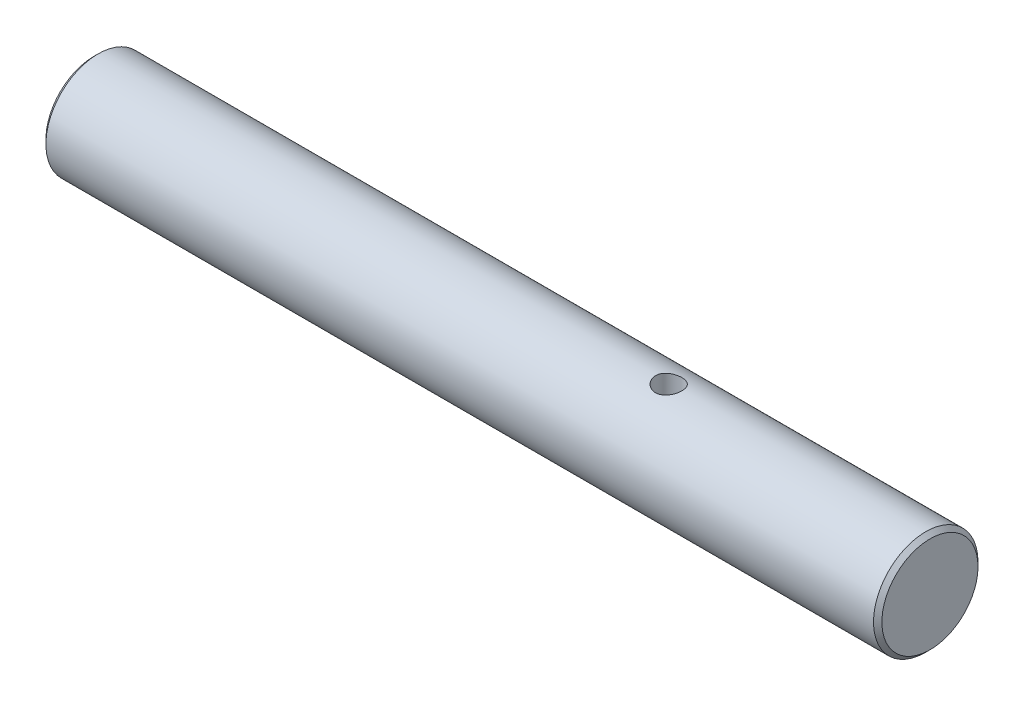
ISO-10303-21;
HEADER;
FILE_DESCRIPTION(('STEP AP214'),'2;1');
FILE_NAME('part.step','',(''),(''),'','','');
FILE_SCHEMA(('AUTOMOTIVE_DESIGN { 1 0 10303 214 1 1 1 1 }'));
ENDSEC;
DATA;
#1=APPLICATION_CONTEXT('core data for automotive mechanical design processes');
#2=APPLICATION_PROTOCOL_DEFINITION('international standard','automotive_design',2000,#1);
#3=PRODUCT_CONTEXT('',#1,'mechanical');
#4=PRODUCT('Part','Part','',(#3));
#5=PRODUCT_RELATED_PRODUCT_CATEGORY('part','',(#4));
#6=PRODUCT_DEFINITION_FORMATION('','',#4);
#7=PRODUCT_DEFINITION_CONTEXT('part definition',#1,'design');
#8=PRODUCT_DEFINITION('design','',#6,#7);
#9=PRODUCT_DEFINITION_SHAPE('','',#8);
#10=(LENGTH_UNIT() NAMED_UNIT(*) SI_UNIT(.MILLI.,.METRE.));
#11=(NAMED_UNIT(*) PLANE_ANGLE_UNIT() SI_UNIT($,.RADIAN.));
#12=(NAMED_UNIT(*) SI_UNIT($,.STERADIAN.) SOLID_ANGLE_UNIT());
#13=UNCERTAINTY_MEASURE_WITH_UNIT(LENGTH_MEASURE(1.E-05),#10,'distance_accuracy_value','');
#14=(GEOMETRIC_REPRESENTATION_CONTEXT(3) GLOBAL_UNCERTAINTY_ASSIGNED_CONTEXT((#13)) GLOBAL_UNIT_ASSIGNED_CONTEXT((#10,
#11,#12)) REPRESENTATION_CONTEXT('',''));
#15=CARTESIAN_POINT('',(0.,0.,0.));
#16=DIRECTION('',(0.,0.,1.));
#17=DIRECTION('',(1.,0.,0.));
#18=AXIS2_PLACEMENT_3D('',#15,#16,#17);
#19=CARTESIAN_POINT('',(-50.8,0.,0.));
#20=DIRECTION('',(1.,0.,0.));
#21=DIRECTION('',(0.,0.,-1.));
#22=AXIS2_PLACEMENT_3D('',#19,#20,#21);
#23=CYLINDRICAL_SURFACE('',#22,3.175);
#24=CARTESIAN_POINT('',(-15.0749,-3.175,0.));
#25=CARTESIAN_POINT('',(-15.0749012192326,-3.17499926061919,0.044194558615329));
#26=CARTESIAN_POINT('',(-15.0785740287583,-3.17406806749438,0.0884026685134962));
#27=CARTESIAN_POINT('',(-15.0931457555988,-3.17044360804568,0.175551121080481));
#28=CARTESIAN_POINT('',(-15.1040486960238,-3.16774936070479,0.218490744013717));
#29=CARTESIAN_POINT('',(-15.1327080596752,-3.16089702486516,0.301831200982996));
#30=CARTESIAN_POINT('',(-15.1504561813665,-3.15674071003248,0.34223504155801));
#31=CARTESIAN_POINT('',(-15.1922727137159,-3.14740649025808,0.419491994408565));
#32=CARTESIAN_POINT('',(-15.2163413623341,-3.14222854685513,0.456344972927149));
#33=CARTESIAN_POINT('',(-15.2706470530135,-3.13129183973811,0.526224337624056));
#34=CARTESIAN_POINT('',(-15.3009913725137,-3.12552400001613,0.559165938248033));
#35=CARTESIAN_POINT('',(-15.3667574018589,-3.11411763042046,0.619550450328698));
#36=CARTESIAN_POINT('',(-15.4021796932234,-3.10847911544268,0.64699273114974));
#37=CARTESIAN_POINT('',(-15.4777566379964,-3.09787815057358,0.69600008056985));
#38=CARTESIAN_POINT('',(-15.5179747585885,-3.09292721458745,0.717469990190073));
#39=CARTESIAN_POINT('',(-15.6015943665704,-3.08439445829358,0.75331107860638));
#40=CARTESIAN_POINT('',(-15.6449953347003,-3.08081241524987,0.767683412377865));
#41=CARTESIAN_POINT('',(-15.7328155539105,-3.07551634735535,0.788631519909633));
#42=CARTESIAN_POINT('',(-15.7771961526226,-3.07376581834439,0.795359890352631));
#43=CARTESIAN_POINT('',(-15.8664880592988,-3.07222173589316,0.801304443009542));
#44=CARTESIAN_POINT('',(-15.9113992782155,-3.0724278586232,0.800521868299323));
#45=CARTESIAN_POINT('',(-15.9993055352324,-3.07474099351563,0.791588424618985));
#46=CARTESIAN_POINT('',(-16.042320515769,-3.07680100843036,0.783619718053222));
#47=CARTESIAN_POINT('',(-16.1263824930664,-3.08251487674085,0.760830938475984));
#48=CARTESIAN_POINT('',(-16.1674293473854,-3.08616884530523,0.746010370389318));
#49=CARTESIAN_POINT('',(-16.2468767679294,-3.09470183518732,0.709784130628984));
#50=CARTESIAN_POINT('',(-16.2852459487121,-3.09959301241528,0.6883126114905));
#51=CARTESIAN_POINT('',(-16.3579018707644,-3.1100424831046,0.639440005835741));
#52=CARTESIAN_POINT('',(-16.3921878854377,-3.11560089494752,0.612037866407233));
#53=CARTESIAN_POINT('',(-16.4567477611494,-3.12695616041351,0.551139708525976));
#54=CARTESIAN_POINT('',(-16.4868764912911,-3.13275525500816,0.517490054895695));
#55=CARTESIAN_POINT('',(-16.5410911437239,-3.14379325801761,0.445546166570213));
#56=CARTESIAN_POINT('',(-16.5651768755484,-3.14903214877261,0.407251785536343));
#57=CARTESIAN_POINT('',(-16.6066763486564,-3.15838622444288,0.326896340185273));
#58=CARTESIAN_POINT('',(-16.6240662020502,-3.16249737135033,0.284822438451066));
#59=CARTESIAN_POINT('',(-16.6514856253308,-3.16910340089186,0.198221723445971));
#60=CARTESIAN_POINT('',(-16.6615166264302,-3.17159859779863,0.153695388957168));
#61=CARTESIAN_POINT('',(-16.6737112297412,-3.17464495997288,0.0646943274563268));
#62=CARTESIAN_POINT('',(-16.6760724329013,-3.17524494120777,0.0202483059449408));
#63=CARTESIAN_POINT('',(-16.6734028175583,-3.17457246064335,-0.0684039206917929));
#64=CARTESIAN_POINT('',(-16.6683726758745,-3.17330017028643,-0.112610147402936));
#65=CARTESIAN_POINT('',(-16.6512259453605,-3.16905741507741,-0.198839104279927));
#66=CARTESIAN_POINT('',(-16.639217438855,-3.16611286597304,-0.240884717578269));
#67=CARTESIAN_POINT('',(-16.6085785508337,-3.15885771002344,-0.322362309386602));
#68=CARTESIAN_POINT('',(-16.5899474944187,-3.15454696395491,-0.361794021029634));
#69=CARTESIAN_POINT('',(-16.5462113450995,-3.14492096545913,-0.437708527148821));
#70=CARTESIAN_POINT('',(-16.5209959478682,-3.13958905668079,-0.474125609611463));
#71=CARTESIAN_POINT('',(-16.4649476077615,-3.12853797087064,-0.54228157627721));
#72=CARTESIAN_POINT('',(-16.4341136789975,-3.12281872598345,-0.574019637677332));
#73=CARTESIAN_POINT('',(-16.3667854891433,-3.11146138201156,-0.632733099761772));
#74=CARTESIAN_POINT('',(-16.3301691147648,-3.10582887507164,-0.659569788448509));
#75=CARTESIAN_POINT('',(-16.2528363077356,-3.0954418007527,-0.7067178848178));
#76=CARTESIAN_POINT('',(-16.2121200564534,-3.09068719456386,-0.72702958098352));
#77=CARTESIAN_POINT('',(-16.1279603632697,-3.08264697495578,-0.760399482295295));
#78=CARTESIAN_POINT('',(-16.0845348216483,-3.07935268742908,-0.773500632643829));
#79=CARTESIAN_POINT('',(-15.9960015824923,-3.07459842402389,-0.792189542961761));
#80=CARTESIAN_POINT('',(-15.9508942622207,-3.07313803927642,-0.797778977689176));
#81=CARTESIAN_POINT('',(-15.8616904129164,-3.07224845084114,-0.801197231842083));
#82=CARTESIAN_POINT('',(-15.8176028289329,-3.07276118203122,-0.799247894762021));
#83=CARTESIAN_POINT('',(-15.7304067603455,-3.07562560581448,-0.788152468719857));
#84=CARTESIAN_POINT('',(-15.6872982554684,-3.07797726029449,-0.779006528913149));
#85=CARTESIAN_POINT('',(-15.6035296832745,-3.08422193358051,-0.75389957508709));
#86=CARTESIAN_POINT('',(-15.5628561934747,-3.08810538809145,-0.737980801869031));
#87=CARTESIAN_POINT('',(-15.4847280381596,-3.09697730115477,-0.699813386650078));
#88=CARTESIAN_POINT('',(-15.4472738271288,-3.10196591537456,-0.677563852803376));
#89=CARTESIAN_POINT('',(-15.3755769264148,-3.11265110668571,-0.626673714409328));
#90=CARTESIAN_POINT('',(-15.3414455414282,-3.11836293275759,-0.597879474387623));
#91=CARTESIAN_POINT('',(-15.2784269237736,-3.12976064187187,-0.535015840835662));
#92=CARTESIAN_POINT('',(-15.2495409413052,-3.13544651841542,-0.500945193291906));
#93=CARTESIAN_POINT('',(-15.1973119956564,-3.14627712643702,-0.427735831864607));
#94=CARTESIAN_POINT('',(-15.1740813546151,-3.15140991323625,-0.388515082759617));
#95=CARTESIAN_POINT('',(-15.1345801613398,-3.16042948515729,-0.306598877697786));
#96=CARTESIAN_POINT('',(-15.1183046818311,-3.16431715187398,-0.263905907189162));
#97=CARTESIAN_POINT('',(-15.0955577242808,-3.16984205709644,-0.184415357963877));
#98=CARTESIAN_POINT('',(-15.087827965283,-3.17176290620974,-0.147992420787638));
#99=CARTESIAN_POINT('',(-15.077498789471,-3.17434213973988,-0.0743828157800313));
#100=CARTESIAN_POINT('',(-15.0748989738368,-3.17500062229747,-0.0371962075462955));
#101=CARTESIAN_POINT('',(-15.0749,-3.175,0.));
#102=B_SPLINE_CURVE_WITH_KNOTS('',3,(#24,#25,#26,#27,#28,#29,#30,#31,#32,#33,#34,#35,#36,#37,
#38,#39,#40,#41,#42,#43,#44,#45,#46,#47,#48,#49,#50,#51,#52,#53,#54,#55,#56,#57,#58,#59,#60,#61,
#62,#63,#64,#65,#66,#67,#68,#69,#70,#71,#72,#73,#74,#75,#76,#77,#78,#79,#80,#81,#82,#83,#84,#85,
#86,#87,#88,#89,#90,#91,#92,#93,#94,#95,#96,#97,#98,#99,#100,#101),.UNSPECIFIED.,.T.,.F.,(4,2,2,
2,2,2,2,2,2,2,2,2,2,2,2,2,2,2,2,2,2,2,2,2,2,2,2,2,2,2,2,2,2,2,2,2,2,2,4),(0.,0.132447354071684,
0.264968468619232,0.397329370188534,0.52969525569568,0.664545055282163,0.799410309959517,
0.936315166227553,1.07319773687421,1.20729686173983,1.34137379332515,1.47214467066986,
1.60292499822566,1.73504389286222,1.86718626293194,2.00315952635134,2.139137074913,
2.27559533237844,2.41202704323488,2.5449146955339,2.67779018017591,2.80866052908661,
2.9395442187261,3.07277948800678,3.20603815875274,3.34262429115238,3.47920438397045,
3.61496196666796,3.75068927680842,3.88245336221338,4.01421471677338,4.145166078079,
4.27613589629705,4.41057382248032,4.54504374892683,4.68199913280024,4.81885733129726,
4.93033988654635,5.0418137744041),.UNSPECIFIED.);
#103=CARTESIAN_POINT('',(-15.0749,-3.175,0.));
#104=VERTEX_POINT('',#103);
#105=EDGE_CURVE('E10',#104,#104,#102,.T.);
#106=ORIENTED_EDGE('',*,*,#105,.F.);
#107=EDGE_LOOP('',(#106));
#108=FACE_BOUND('',#107,.T.);
#109=CARTESIAN_POINT('',(-15.875,3.07253396889278,0.8001));
#110=CARTESIAN_POINT('',(-15.8308305672585,3.0725348051082,0.80009876608396));
#111=CARTESIAN_POINT('',(-15.7866475523915,3.07349681294689,0.796429988216414));
#112=CARTESIAN_POINT('',(-15.6995511578479,3.07723087527521,0.781875724183331));
#113=CARTESIAN_POINT('',(-15.6566385197715,3.08000396604764,0.770986106273648));
#114=CARTESIAN_POINT('',(-15.5733552955042,3.08702663169601,0.742365674066662));
#115=CARTESIAN_POINT('',(-15.5329814732543,3.09127428006682,0.724643782790454));
#116=CARTESIAN_POINT('',(-15.4557753772485,3.10076505222951,0.682889132424946));
#117=CARTESIAN_POINT('',(-15.4189432687616,3.10600822244208,0.658856079029204));
#118=CARTESIAN_POINT('',(-15.3490427034007,3.11703050169978,0.604587336015973));
#119=CARTESIAN_POINT('',(-15.3160651058038,3.1228182852127,0.5742363543937));
#120=CARTESIAN_POINT('',(-15.2556104476428,3.1342024484424,0.508441593428325));
#121=CARTESIAN_POINT('',(-15.2281339076589,3.13979881000288,0.472997332638834));
#122=CARTESIAN_POINT('',(-15.1790887517436,3.15026563982044,0.397398807294971));
#123=CARTESIAN_POINT('',(-15.157609519229,3.15512467848743,0.357184835065325));
#124=CARTESIAN_POINT('',(-15.1217500781348,3.16347035165026,0.273574109685516));
#125=CARTESIAN_POINT('',(-15.1073688047817,3.16695719197537,0.230177835038971));
#126=CARTESIAN_POINT('',(-15.0864048936885,3.17210427187305,0.142381715626149));
#127=CARTESIAN_POINT('',(-15.0796679311182,3.17380060737892,0.0980208732345284));
#128=CARTESIAN_POINT('',(-15.0736993317476,3.17530138089332,0.00876837200928309));
#129=CARTESIAN_POINT('',(-15.0744665681941,3.17510610292711,-0.0361232061235494));
#130=CARTESIAN_POINT('',(-15.0833738651718,3.17287247229481,-0.124092092626158));
#131=CARTESIAN_POINT('',(-15.0913473286862,3.17087576768535,-0.167187486725854));
#132=CARTESIAN_POINT('',(-15.1141727991222,3.16531220584472,-0.251407740714446));
#133=CARTESIAN_POINT('',(-15.1290251754708,3.1617452642856,-0.292532494640615));
#134=CARTESIAN_POINT('',(-15.165320824012,3.15337852921137,-0.372081404316347));
#135=CARTESIAN_POINT('',(-15.1868231254213,3.14856776001674,-0.410477425105128));
#136=CARTESIAN_POINT('',(-15.2357634129958,3.13823480239744,-0.483174376361823));
#137=CARTESIAN_POINT('',(-15.2632024466213,3.13271248849945,-0.517474582516192));
#138=CARTESIAN_POINT('',(-15.324129371882,3.12137870903818,-0.581999914997204));
#139=CARTESIAN_POINT('',(-15.3577628117916,3.11556346791151,-0.612087095596401));
#140=CARTESIAN_POINT('',(-15.4296586440963,3.10443793195679,-0.666225302222772));
#141=CARTESIAN_POINT('',(-15.467921259912,3.09912766152255,-0.690276036737161));
#142=CARTESIAN_POINT('',(-15.5482632249244,3.08959960327955,-0.731748883874923));
#143=CARTESIAN_POINT('',(-15.5903606826335,3.08538740444006,-0.749137289300718));
#144=CARTESIAN_POINT('',(-15.6770132487871,3.07860382582511,-0.776546858345657));
#145=CARTESIAN_POINT('',(-15.7215678194291,3.0760320885288,-0.78656962729809));
#146=CARTESIAN_POINT('',(-15.810589316992,3.07289578590832,-0.798733500138195));
#147=CARTESIAN_POINT('',(-15.8550265470909,3.07227923911193,-0.801078776861646));
#148=CARTESIAN_POINT('',(-15.9436575894475,3.07298154579149,-0.79838047392185));
#149=CARTESIAN_POINT('',(-15.9878514241246,3.0743002179154,-0.793337586613739));
#150=CARTESIAN_POINT('',(-16.0739797054792,3.078674523571,-0.776185241982357));
#151=CARTESIAN_POINT('',(-16.1159395483724,3.08170080558703,-0.764195107307213));
#152=CARTESIAN_POINT('',(-16.1972536070939,3.08912138373645,-0.733621139693018));
#153=CARTESIAN_POINT('',(-16.2366075097886,3.09351584391164,-0.715036516050668));
#154=CARTESIAN_POINT('',(-16.3124563945191,3.10328675549971,-0.671375278486681));
#155=CARTESIAN_POINT('',(-16.3488789115875,3.10868100608242,-0.646176849375096));
#156=CARTESIAN_POINT('',(-16.4170535388242,3.11980024567038,-0.590156963316061));
#157=CARTESIAN_POINT('',(-16.4488048669868,3.12552528983102,-0.559334566788143));
#158=CARTESIAN_POINT('',(-16.5075652752706,3.1368375442012,-0.492003797605879));
#159=CARTESIAN_POINT('',(-16.5344329804822,3.14241753035757,-0.455370603384024));
#160=CARTESIAN_POINT('',(-16.5816355826269,3.15266017208134,-0.37799409525176));
#161=CARTESIAN_POINT('',(-16.6019708216732,3.15732287568298,-0.337250996728904));
#162=CARTESIAN_POINT('',(-16.6353533425045,3.16517608708767,-0.253093808281745));
#163=CARTESIAN_POINT('',(-16.648453333548,3.16837721210682,-0.20970166415928));
#164=CARTESIAN_POINT('',(-16.6671511626675,3.17299309716398,-0.121240327413036));
#165=CARTESIAN_POINT('',(-16.672750473423,3.17440820786392,-0.0761714657815543));
#166=CARTESIAN_POINT('',(-16.6762040473025,3.17527804356187,0.0130366929719295));
#167=CARTESIAN_POINT('',(-16.6742667970396,3.17478554122156,0.0571675254998983));
#168=CARTESIAN_POINT('',(-16.6631805391684,3.17201278591017,0.144453392991355));
#169=CARTESIAN_POINT('',(-16.6540317523715,3.16973258767686,0.187608457790416));
#170=CARTESIAN_POINT('',(-16.6288946759822,3.16364908220415,0.271495733854131));
#171=CARTESIAN_POINT('',(-16.6129446269524,3.15985429834767,0.31224006253659));
#172=CARTESIAN_POINT('',(-16.574692400912,3.15114088344559,0.390497311080539));
#173=CARTESIAN_POINT('',(-16.5523894119771,3.14622210876655,0.428009817106926));
#174=CARTESIAN_POINT('',(-16.5014315667621,3.13564137420049,0.499725063525822));
#175=CARTESIAN_POINT('',(-16.4726356294112,3.12996426893402,0.533825322892189));
#176=CARTESIAN_POINT('',(-16.4097824662886,3.1185740164936,0.596780398276611));
#177=CARTESIAN_POINT('',(-16.3757239031007,3.11286086051291,0.625633876836479));
#178=CARTESIAN_POINT('',(-16.30253186578,3.10192138340788,0.677816154241447));
#179=CARTESIAN_POINT('',(-16.2633141251648,3.09670640036459,0.701029325715569));
#180=CARTESIAN_POINT('',(-16.1814068362831,3.08750714520526,0.740498623876105));
#181=CARTESIAN_POINT('',(-16.1387198111394,3.08352198860927,0.756759753666212));
#182=CARTESIAN_POINT('',(-16.05926424991,3.0778483901463,0.779476362570762));
#183=CARTESIAN_POINT('',(-16.0228719317288,3.07587060885164,0.787193219392023));
#184=CARTESIAN_POINT('',(-15.949322902682,3.07321310375089,0.797505330997217));
#185=CARTESIAN_POINT('',(-15.9121662596438,3.07253326526138,0.800101038275592));
#186=CARTESIAN_POINT('',(-15.875,3.07253396889278,0.8001));
#187=B_SPLINE_CURVE_WITH_KNOTS('',3,(#109,#110,#111,#112,#113,#114,#115,#116,#117,#118,#119,
#120,#121,#122,#123,#124,#125,#126,#127,#128,#129,#130,#131,#132,#133,#134,#135,#136,#137,#138,
#139,#140,#141,#142,#143,#144,#145,#146,#147,#148,#149,#150,#151,#152,#153,#154,#155,#156,#157,
#158,#159,#160,#161,#162,#163,#164,#165,#166,#167,#168,#169,#170,#171,#172,#173,#174,#175,#176,
#177,#178,#179,#180,#181,#182,#183,#184,#185,#186),.UNSPECIFIED.,.T.,.F.,(4,2,2,2,2,2,2,2,2,2,2,
2,2,2,2,2,2,2,2,2,2,2,2,2,2,2,2,2,2,2,2,2,2,2,2,2,2,2,4),(0.,0.132371791473475,
0.264819391145222,0.397094595650513,0.529375969599578,0.664324502713228,0.799285800348928,
0.936162550045837,1.07301876044725,1.20705999107345,1.34108109575677,1.4720809347437,
1.6030878097993,1.73529269283765,1.86752092078446,2.00338412742358,2.13925389392323,
2.27580227382503,2.41232088430719,2.54517813851154,2.67802294327399,2.80865099299603,
2.93929471079365,3.07253788155873,3.20580333330295,3.342462890599,3.47911528970157,
3.61475857455171,3.75037522336786,3.882267296098,4.01415533056015,4.14531139561969,
4.27648423033722,4.41084208473558,4.5452341404627,4.68218456357767,4.81903626241781,
4.93043002105086,5.04181393671525),.UNSPECIFIED.);
#188=CARTESIAN_POINT('',(-15.875,3.07253396889278,0.8001));
#189=VERTEX_POINT('',#188);
#190=EDGE_CURVE('E57',#189,#189,#187,.T.);
#191=ORIENTED_EDGE('',*,*,#190,.F.);
#192=EDGE_LOOP('',(#191));
#193=FACE_BOUND('',#192,.T.);
#194=CARTESIAN_POINT('',(-50.546,0.,0.));
#195=DIRECTION('',(1.,0.,0.));
#196=DIRECTION('',(0.,0.,-1.));
#197=AXIS2_PLACEMENT_3D('',#194,#195,#196);
#198=CIRCLE('',#197,3.175);
#199=CARTESIAN_POINT('',(-50.546,0.,-3.175));
#200=VERTEX_POINT('',#199);
#201=EDGE_CURVE('E99',#200,#200,#198,.T.);
#202=ORIENTED_EDGE('',*,*,#201,.T.);
#203=EDGE_LOOP('',(#202));
#204=FACE_BOUND('',#203,.T.);
#205=CARTESIAN_POINT('',(-0.254000000000004,0.,0.));
#206=DIRECTION('',(1.,0.,0.));
#207=DIRECTION('',(0.,0.,-1.));
#208=AXIS2_PLACEMENT_3D('',#205,#206,#207);
#209=CIRCLE('',#208,3.175);
#210=CARTESIAN_POINT('',(-0.254000000000004,0.,-3.175));
#211=VERTEX_POINT('',#210);
#212=EDGE_CURVE('E103',#211,#211,#209,.F.);
#213=ORIENTED_EDGE('',*,*,#212,.T.);
#214=EDGE_LOOP('',(#213));
#215=FACE_BOUND('',#214,.T.);
#216=ADVANCED_FACE('F43',(#108,#193,#204,#215),#23,.T.);
#217=CARTESIAN_POINT('',(-50.8,0.,0.));
#218=DIRECTION('',(1.,0.,0.));
#219=DIRECTION('',(0.,0.,-1.));
#220=AXIS2_PLACEMENT_3D('',#217,#218,#219);
#221=PLANE('',#220);
#222=CARTESIAN_POINT('',(-50.8,0.,0.));
#223=DIRECTION('',(1.,0.,0.));
#224=DIRECTION('',(0.,0.,-1.));
#225=AXIS2_PLACEMENT_3D('',#222,#223,#224);
#226=CIRCLE('',#225,2.92100000000001);
#227=CARTESIAN_POINT('',(-50.8,0.,-2.92100000000001));
#228=VERTEX_POINT('',#227);
#229=EDGE_CURVE('E67',#228,#228,#226,.F.);
#230=ORIENTED_EDGE('',*,*,#229,.T.);
#231=EDGE_LOOP('',(#230));
#232=FACE_BOUND('',#231,.T.);
#233=ADVANCED_FACE('F79',(#232),#221,.F.);
#234=CARTESIAN_POINT('',(0.,0.,0.));
#235=DIRECTION('',(1.,0.,0.));
#236=DIRECTION('',(0.,0.,-1.));
#237=AXIS2_PLACEMENT_3D('',#234,#235,#236);
#238=PLANE('',#237);
#239=CARTESIAN_POINT('',(0.,0.,0.));
#240=DIRECTION('',(1.,0.,0.));
#241=DIRECTION('',(0.,0.,-1.));
#242=AXIS2_PLACEMENT_3D('',#239,#240,#241);
#243=CIRCLE('',#242,2.921);
#244=CARTESIAN_POINT('',(0.,0.,-2.921));
#245=VERTEX_POINT('',#244);
#246=EDGE_CURVE('E62',#245,#245,#243,.T.);
#247=ORIENTED_EDGE('',*,*,#246,.T.);
#248=EDGE_LOOP('',(#247));
#249=FACE_BOUND('',#248,.T.);
#250=ADVANCED_FACE('F82',(#249),#238,.T.);
#251=CARTESIAN_POINT('',(-50.546,0.,0.));
#252=DIRECTION('',(1.,0.,0.));
#253=DIRECTION('',(0.,0.,-1.));
#254=AXIS2_PLACEMENT_3D('',#251,#252,#253);
#255=CONICAL_SURFACE('',#254,3.175,0.78539816339744);
#256=ORIENTED_EDGE('',*,*,#229,.F.);
#257=EDGE_LOOP('',(#256));
#258=FACE_BOUND('',#257,.T.);
#259=ORIENTED_EDGE('',*,*,#201,.F.);
#260=EDGE_LOOP('',(#259));
#261=FACE_BOUND('',#260,.T.);
#262=ADVANCED_FACE('F84',(#258,#261),#255,.T.);
#263=CARTESIAN_POINT('',(0.,0.,0.));
#264=DIRECTION('',(-1.,0.,0.));
#265=DIRECTION('',(0.,0.,1.));
#266=AXIS2_PLACEMENT_3D('',#263,#264,#265);
#267=CONICAL_SURFACE('',#266,2.921,0.78539816339744);
#268=ORIENTED_EDGE('',*,*,#212,.F.);
#269=EDGE_LOOP('',(#268));
#270=FACE_BOUND('',#269,.T.);
#271=ORIENTED_EDGE('',*,*,#246,.F.);
#272=EDGE_LOOP('',(#271));
#273=FACE_BOUND('',#272,.T.);
#274=ADVANCED_FACE('F44',(#270,#273),#267,.T.);
#275=CARTESIAN_POINT('',(-15.875,-3.175,0.));
#276=DIRECTION('',(0.,1.,0.));
#277=DIRECTION('',(0.,0.,1.));
#278=AXIS2_PLACEMENT_3D('',#275,#276,#277);
#279=CYLINDRICAL_SURFACE('',#278,0.8001);
#280=ORIENTED_EDGE('',*,*,#105,.T.);
#281=EDGE_LOOP('',(#280));
#282=FACE_BOUND('',#281,.T.);
#283=ORIENTED_EDGE('',*,*,#190,.T.);
#284=EDGE_LOOP('',(#283));
#285=FACE_BOUND('',#284,.T.);
#286=ADVANCED_FACE('F74',(#282,#285),#279,.F.);
#287=CLOSED_SHELL('',(#216,#233,#250,#262,#274,#286));
#288=MANIFOLD_SOLID_BREP('B2',#287);
#289=ADVANCED_BREP_SHAPE_REPRESENTATION('',(#18,#288),#14);
#290=SHAPE_DEFINITION_REPRESENTATION(#9,#289);
ENDSEC;
END-ISO-10303-21;
